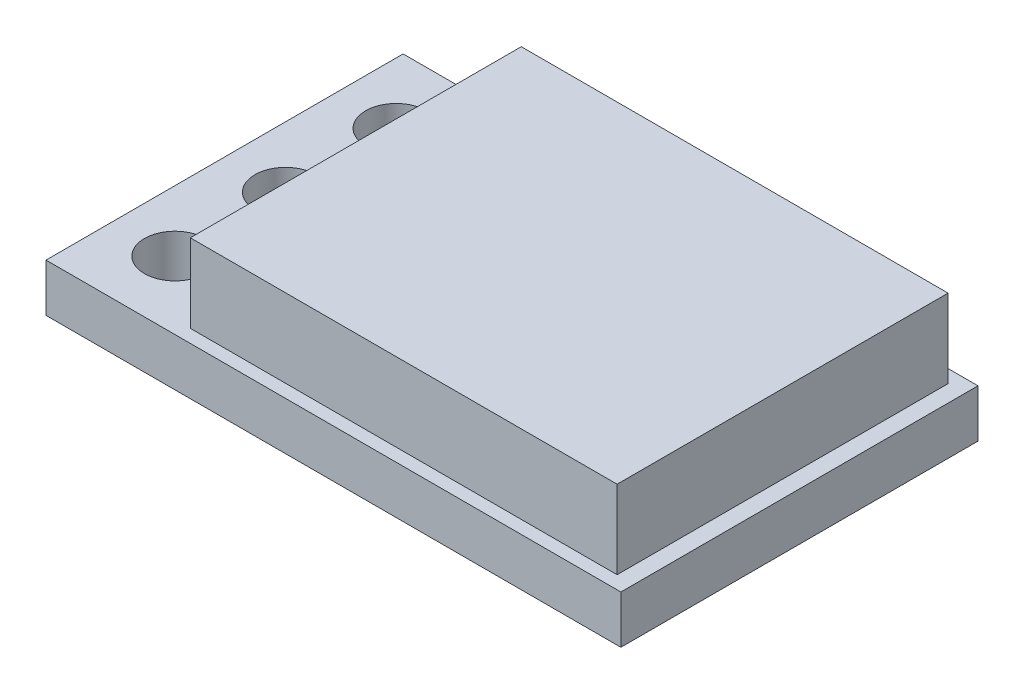
ISO-10303-21;
HEADER;
FILE_DESCRIPTION(('STEP AP214'),'2;1');
FILE_NAME('part.step','',(''),(''),'','','');
FILE_SCHEMA(('AUTOMOTIVE_DESIGN { 1 0 10303 214 1 1 1 1 }'));
ENDSEC;
DATA;
#1=APPLICATION_CONTEXT('core data for automotive mechanical design processes');
#2=APPLICATION_PROTOCOL_DEFINITION('international standard','automotive_design',2000,#1);
#3=PRODUCT_CONTEXT('',#1,'mechanical');
#4=PRODUCT('Part','Part','',(#3));
#5=PRODUCT_RELATED_PRODUCT_CATEGORY('part','',(#4));
#6=PRODUCT_DEFINITION_FORMATION('','',#4);
#7=PRODUCT_DEFINITION_CONTEXT('part definition',#1,'design');
#8=PRODUCT_DEFINITION('design','',#6,#7);
#9=PRODUCT_DEFINITION_SHAPE('','',#8);
#10=(LENGTH_UNIT() NAMED_UNIT(*) SI_UNIT(.MILLI.,.METRE.));
#11=(NAMED_UNIT(*) PLANE_ANGLE_UNIT() SI_UNIT($,.RADIAN.));
#12=(NAMED_UNIT(*) SI_UNIT($,.STERADIAN.) SOLID_ANGLE_UNIT());
#13=UNCERTAINTY_MEASURE_WITH_UNIT(LENGTH_MEASURE(1.E-05),#10,'distance_accuracy_value','');
#14=(GEOMETRIC_REPRESENTATION_CONTEXT(3) GLOBAL_UNCERTAINTY_ASSIGNED_CONTEXT((#13)) GLOBAL_UNIT_ASSIGNED_CONTEXT((#10,
#11,#12)) REPRESENTATION_CONTEXT('',''));
#15=CARTESIAN_POINT('',(0.,0.,0.));
#16=DIRECTION('',(0.,0.,1.));
#17=DIRECTION('',(1.,0.,0.));
#18=AXIS2_PLACEMENT_3D('',#15,#16,#17);
#19=CARTESIAN_POINT('',(6.6,1.1,-4.1));
#20=DIRECTION('',(-1.,0.,0.));
#21=DIRECTION('',(0.,0.,1.));
#22=AXIS2_PLACEMENT_3D('',#19,#20,#21);
#23=PLANE('',#22);
#24=DIRECTION('',(0.,0.,-1.));
#25=VECTOR('',#24,1.);
#26=CARTESIAN_POINT('',(6.6,0.,-4.1));
#27=LINE('',#26,#25);
#28=CARTESIAN_POINT('',(6.6,0.,4.1));
#29=VERTEX_POINT('',#28);
#30=CARTESIAN_POINT('',(6.6,0.,-4.1));
#31=VERTEX_POINT('',#30);
#32=EDGE_CURVE('E118',#29,#31,#27,.T.);
#33=ORIENTED_EDGE('',*,*,#32,.T.);
#34=DIRECTION('',(0.,-1.,0.));
#35=VECTOR('',#34,1.);
#36=CARTESIAN_POINT('',(6.6,1.1,-4.1));
#37=LINE('',#36,#35);
#38=CARTESIAN_POINT('',(6.6,1.1,-4.1));
#39=VERTEX_POINT('',#38);
#40=EDGE_CURVE('E11',#39,#31,#37,.T.);
#41=ORIENTED_EDGE('',*,*,#40,.F.);
#42=DIRECTION('',(0.,0.,-1.));
#43=VECTOR('',#42,1.);
#44=CARTESIAN_POINT('',(6.6,1.1,-4.1));
#45=LINE('',#44,#43);
#46=CARTESIAN_POINT('',(6.6,1.1,4.1));
#47=VERTEX_POINT('',#46);
#48=EDGE_CURVE('E127',#47,#39,#45,.T.);
#49=ORIENTED_EDGE('',*,*,#48,.F.);
#50=DIRECTION('',(0.,-1.,0.));
#51=VECTOR('',#50,1.);
#52=CARTESIAN_POINT('',(6.6,1.1,4.1));
#53=LINE('',#52,#51);
#54=EDGE_CURVE('E136',#47,#29,#53,.T.);
#55=ORIENTED_EDGE('',*,*,#54,.T.);
#56=EDGE_LOOP('',(#33,#41,#49,#55));
#57=FACE_BOUND('',#56,.T.);
#58=ADVANCED_FACE('F34',(#57),#23,.F.);
#59=CARTESIAN_POINT('',(-6.6,1.1,-4.1));
#60=DIRECTION('',(0.,0.,1.));
#61=DIRECTION('',(1.,0.,0.));
#62=AXIS2_PLACEMENT_3D('',#59,#60,#61);
#63=PLANE('',#62);
#64=DIRECTION('',(-1.,0.,0.));
#65=VECTOR('',#64,1.);
#66=CARTESIAN_POINT('',(-6.6,0.,-4.1));
#67=LINE('',#66,#65);
#68=CARTESIAN_POINT('',(-6.6,0.,-4.1));
#69=VERTEX_POINT('',#68);
#70=EDGE_CURVE('E121',#31,#69,#67,.T.);
#71=ORIENTED_EDGE('',*,*,#70,.T.);
#72=DIRECTION('',(0.,-1.,0.));
#73=VECTOR('',#72,1.);
#74=CARTESIAN_POINT('',(-6.6,1.1,-4.1));
#75=LINE('',#74,#73);
#76=CARTESIAN_POINT('',(-6.6,1.1,-4.1));
#77=VERTEX_POINT('',#76);
#78=EDGE_CURVE('E41',#77,#69,#75,.T.);
#79=ORIENTED_EDGE('',*,*,#78,.F.);
#80=DIRECTION('',(-1.,0.,0.));
#81=VECTOR('',#80,1.);
#82=CARTESIAN_POINT('',(-6.6,1.1,-4.1));
#83=LINE('',#82,#81);
#84=EDGE_CURVE('E130',#39,#77,#83,.T.);
#85=ORIENTED_EDGE('',*,*,#84,.F.);
#86=ORIENTED_EDGE('',*,*,#40,.T.);
#87=EDGE_LOOP('',(#71,#79,#85,#86));
#88=FACE_BOUND('',#87,.T.);
#89=ADVANCED_FACE('F167',(#88),#63,.F.);
#90=CARTESIAN_POINT('',(-6.6,1.1,-4.1));
#91=DIRECTION('',(1.,0.,0.));
#92=DIRECTION('',(0.,0.,-1.));
#93=AXIS2_PLACEMENT_3D('',#90,#91,#92);
#94=PLANE('',#93);
#95=DIRECTION('',(0.,0.,1.));
#96=VECTOR('',#95,1.);
#97=CARTESIAN_POINT('',(-6.6,0.,-4.1));
#98=LINE('',#97,#96);
#99=CARTESIAN_POINT('',(-6.6,0.,4.1));
#100=VERTEX_POINT('',#99);
#101=EDGE_CURVE('E139',#69,#100,#98,.T.);
#102=ORIENTED_EDGE('',*,*,#101,.T.);
#103=DIRECTION('',(0.,-1.,0.));
#104=VECTOR('',#103,1.);
#105=CARTESIAN_POINT('',(-6.6,1.1,4.1));
#106=LINE('',#105,#104);
#107=CARTESIAN_POINT('',(-6.6,1.1,4.1));
#108=VERTEX_POINT('',#107);
#109=EDGE_CURVE('E144',#108,#100,#106,.T.);
#110=ORIENTED_EDGE('',*,*,#109,.F.);
#111=DIRECTION('',(0.,0.,1.));
#112=VECTOR('',#111,1.);
#113=CARTESIAN_POINT('',(-6.6,1.1,-4.1));
#114=LINE('',#113,#112);
#115=EDGE_CURVE('E133',#77,#108,#114,.T.);
#116=ORIENTED_EDGE('',*,*,#115,.F.);
#117=ORIENTED_EDGE('',*,*,#78,.T.);
#118=EDGE_LOOP('',(#102,#110,#116,#117));
#119=FACE_BOUND('',#118,.T.);
#120=ADVANCED_FACE('F151',(#119),#94,.F.);
#121=CARTESIAN_POINT('',(-6.6,1.1,4.1));
#122=DIRECTION('',(0.,0.,-1.));
#123=DIRECTION('',(-1.,0.,0.));
#124=AXIS2_PLACEMENT_3D('',#121,#122,#123);
#125=PLANE('',#124);
#126=DIRECTION('',(1.,0.,0.));
#127=VECTOR('',#126,1.);
#128=CARTESIAN_POINT('',(-6.6,0.,4.1));
#129=LINE('',#128,#127);
#130=EDGE_CURVE('E131',#100,#29,#129,.T.);
#131=ORIENTED_EDGE('',*,*,#130,.T.);
#132=ORIENTED_EDGE('',*,*,#54,.F.);
#133=DIRECTION('',(1.,0.,0.));
#134=VECTOR('',#133,1.);
#135=CARTESIAN_POINT('',(-6.6,1.1,4.1));
#136=LINE('',#135,#134);
#137=EDGE_CURVE('E135',#108,#47,#136,.T.);
#138=ORIENTED_EDGE('',*,*,#137,.F.);
#139=ORIENTED_EDGE('',*,*,#109,.T.);
#140=EDGE_LOOP('',(#131,#132,#138,#139));
#141=FACE_BOUND('',#140,.T.);
#142=ADVANCED_FACE('F160',(#141),#125,.F.);
#143=CARTESIAN_POINT('',(0.,1.1,0.));
#144=DIRECTION('',(0.,1.,0.));
#145=DIRECTION('',(0.,0.,1.));
#146=AXIS2_PLACEMENT_3D('',#143,#144,#145);
#147=PLANE('',#146);
#148=CARTESIAN_POINT('',(-5.19999999999999,1.1,2.54));
#149=DIRECTION('',(0.,1.,0.));
#150=DIRECTION('',(0.,0.,1.));
#151=AXIS2_PLACEMENT_3D('',#148,#149,#150);
#152=CIRCLE('',#151,0.700000000000002);
#153=CARTESIAN_POINT('',(-5.19999999999999,1.1,3.24));
#154=VERTEX_POINT('',#153);
#155=EDGE_CURVE('E216',#154,#154,#152,.T.);
#156=ORIENTED_EDGE('',*,*,#155,.F.);
#157=EDGE_LOOP('',(#156));
#158=FACE_BOUND('',#157,.T.);
#159=CARTESIAN_POINT('',(-5.2,1.1,0.));
#160=DIRECTION('',(0.,1.,0.));
#161=DIRECTION('',(0.,0.,1.));
#162=AXIS2_PLACEMENT_3D('',#159,#160,#161);
#163=CIRCLE('',#162,0.700000000000002);
#164=CARTESIAN_POINT('',(-5.2,1.1,0.700000000000002));
#165=VERTEX_POINT('',#164);
#166=EDGE_CURVE('E221',#165,#165,#163,.T.);
#167=ORIENTED_EDGE('',*,*,#166,.F.);
#168=EDGE_LOOP('',(#167));
#169=FACE_BOUND('',#168,.T.);
#170=CARTESIAN_POINT('',(-5.20000000000001,1.1,-2.54));
#171=DIRECTION('',(0.,1.,0.));
#172=DIRECTION('',(0.,0.,1.));
#173=AXIS2_PLACEMENT_3D('',#170,#171,#172);
#174=CIRCLE('',#173,0.700000000000002);
#175=CARTESIAN_POINT('',(-5.20000000000001,1.1,-1.84));
#176=VERTEX_POINT('',#175);
#177=EDGE_CURVE('E229',#176,#176,#174,.T.);
#178=ORIENTED_EDGE('',*,*,#177,.F.);
#179=EDGE_LOOP('',(#178));
#180=FACE_BOUND('',#179,.T.);
#181=DIRECTION('',(0.,0.,-1.));
#182=VECTOR('',#181,1.);
#183=CARTESIAN_POINT('',(6.21315789473685,1.1,-3.8));
#184=LINE('',#183,#182);
#185=CARTESIAN_POINT('',(6.21315789473685,1.1,3.8));
#186=VERTEX_POINT('',#185);
#187=CARTESIAN_POINT('',(6.21315789473685,1.1,-3.8));
#188=VERTEX_POINT('',#187);
#189=EDGE_CURVE('E48',#186,#188,#184,.T.);
#190=ORIENTED_EDGE('',*,*,#189,.F.);
#191=DIRECTION('',(1.,0.,0.));
#192=VECTOR('',#191,1.);
#193=CARTESIAN_POINT('',(-3.58684210526315,1.1,3.8));
#194=LINE('',#193,#192);
#195=CARTESIAN_POINT('',(-3.58684210526315,1.1,3.8));
#196=VERTEX_POINT('',#195);
#197=EDGE_CURVE('E52',#196,#186,#194,.T.);
#198=ORIENTED_EDGE('',*,*,#197,.F.);
#199=DIRECTION('',(0.,0.,1.));
#200=VECTOR('',#199,1.);
#201=CARTESIAN_POINT('',(-3.58684210526316,1.1,-3.8));
#202=LINE('',#201,#200);
#203=CARTESIAN_POINT('',(-3.58684210526316,1.1,-3.8));
#204=VERTEX_POINT('',#203);
#205=EDGE_CURVE('E238',#204,#196,#202,.T.);
#206=ORIENTED_EDGE('',*,*,#205,.F.);
#207=DIRECTION('',(-1.,0.,0.));
#208=VECTOR('',#207,1.);
#209=CARTESIAN_POINT('',(-3.58684210526316,1.1,-3.8));
#210=LINE('',#209,#208);
#211=EDGE_CURVE('E236',#188,#204,#210,.T.);
#212=ORIENTED_EDGE('',*,*,#211,.F.);
#213=EDGE_LOOP('',(#190,#198,#206,#212));
#214=FACE_BOUND('',#213,.T.);
#215=ORIENTED_EDGE('',*,*,#48,.T.);
#216=ORIENTED_EDGE('',*,*,#84,.T.);
#217=ORIENTED_EDGE('',*,*,#115,.T.);
#218=ORIENTED_EDGE('',*,*,#137,.T.);
#219=EDGE_LOOP('',(#215,#216,#217,#218));
#220=FACE_BOUND('',#219,.T.);
#221=ADVANCED_FACE('F166',(#158,#169,#180,#214,#220),#147,.T.);
#222=CARTESIAN_POINT('',(0.,0.,0.));
#223=DIRECTION('',(0.,1.,0.));
#224=DIRECTION('',(0.,0.,1.));
#225=AXIS2_PLACEMENT_3D('',#222,#223,#224);
#226=PLANE('',#225);
#227=CARTESIAN_POINT('',(-5.19999999999999,0.,2.54));
#228=DIRECTION('',(0.,1.,0.));
#229=DIRECTION('',(0.,0.,1.));
#230=AXIS2_PLACEMENT_3D('',#227,#228,#229);
#231=CIRCLE('',#230,0.700000000000002);
#232=CARTESIAN_POINT('',(-5.19999999999999,0.,3.24));
#233=VERTEX_POINT('',#232);
#234=EDGE_CURVE('E213',#233,#233,#231,.T.);
#235=ORIENTED_EDGE('',*,*,#234,.T.);
#236=EDGE_LOOP('',(#235));
#237=FACE_BOUND('',#236,.T.);
#238=CARTESIAN_POINT('',(-5.2,0.,0.));
#239=DIRECTION('',(0.,1.,0.));
#240=DIRECTION('',(0.,0.,1.));
#241=AXIS2_PLACEMENT_3D('',#238,#239,#240);
#242=CIRCLE('',#241,0.700000000000002);
#243=CARTESIAN_POINT('',(-5.2,0.,0.700000000000002));
#244=VERTEX_POINT('',#243);
#245=EDGE_CURVE('E217',#244,#244,#242,.T.);
#246=ORIENTED_EDGE('',*,*,#245,.T.);
#247=EDGE_LOOP('',(#246));
#248=FACE_BOUND('',#247,.T.);
#249=CARTESIAN_POINT('',(-5.20000000000001,0.,-2.54));
#250=DIRECTION('',(0.,1.,0.));
#251=DIRECTION('',(0.,0.,1.));
#252=AXIS2_PLACEMENT_3D('',#249,#250,#251);
#253=CIRCLE('',#252,0.700000000000002);
#254=CARTESIAN_POINT('',(-5.20000000000001,0.,-1.84));
#255=VERTEX_POINT('',#254);
#256=EDGE_CURVE('E226',#255,#255,#253,.T.);
#257=ORIENTED_EDGE('',*,*,#256,.T.);
#258=EDGE_LOOP('',(#257));
#259=FACE_BOUND('',#258,.T.);
#260=ORIENTED_EDGE('',*,*,#32,.F.);
#261=ORIENTED_EDGE('',*,*,#130,.F.);
#262=ORIENTED_EDGE('',*,*,#101,.F.);
#263=ORIENTED_EDGE('',*,*,#70,.F.);
#264=EDGE_LOOP('',(#260,#261,#262,#263));
#265=FACE_BOUND('',#264,.T.);
#266=ADVANCED_FACE('F157',(#237,#248,#259,#265),#226,.F.);
#267=CARTESIAN_POINT('',(6.21315789473685,2.9,-3.8));
#268=DIRECTION('',(-1.,0.,0.));
#269=DIRECTION('',(0.,0.,1.));
#270=AXIS2_PLACEMENT_3D('',#267,#268,#269);
#271=PLANE('',#270);
#272=ORIENTED_EDGE('',*,*,#189,.T.);
#273=DIRECTION('',(0.,-1.,0.));
#274=VECTOR('',#273,1.);
#275=CARTESIAN_POINT('',(6.21315789473685,2.9,-3.8));
#276=LINE('',#275,#274);
#277=CARTESIAN_POINT('',(6.21315789473685,2.9,-3.8));
#278=VERTEX_POINT('',#277);
#279=EDGE_CURVE('E101',#278,#188,#276,.T.);
#280=ORIENTED_EDGE('',*,*,#279,.F.);
#281=DIRECTION('',(0.,0.,-1.));
#282=VECTOR('',#281,1.);
#283=CARTESIAN_POINT('',(6.21315789473685,2.9,-3.8));
#284=LINE('',#283,#282);
#285=CARTESIAN_POINT('',(6.21315789473685,2.9,3.8));
#286=VERTEX_POINT('',#285);
#287=EDGE_CURVE('E107',#286,#278,#284,.T.);
#288=ORIENTED_EDGE('',*,*,#287,.F.);
#289=DIRECTION('',(0.,-1.,0.));
#290=VECTOR('',#289,1.);
#291=CARTESIAN_POINT('',(6.21315789473685,2.9,3.8));
#292=LINE('',#291,#290);
#293=EDGE_CURVE('E234',#286,#186,#292,.T.);
#294=ORIENTED_EDGE('',*,*,#293,.T.);
#295=EDGE_LOOP('',(#272,#280,#288,#294));
#296=FACE_BOUND('',#295,.T.);
#297=ADVANCED_FACE('F117',(#296),#271,.F.);
#298=CARTESIAN_POINT('',(-3.58684210526316,2.9,-3.8));
#299=DIRECTION('',(0.,0.,1.));
#300=DIRECTION('',(1.,0.,0.));
#301=AXIS2_PLACEMENT_3D('',#298,#299,#300);
#302=PLANE('',#301);
#303=ORIENTED_EDGE('',*,*,#211,.T.);
#304=DIRECTION('',(0.,-1.,0.));
#305=VECTOR('',#304,1.);
#306=CARTESIAN_POINT('',(-3.58684210526316,2.9,-3.8));
#307=LINE('',#306,#305);
#308=CARTESIAN_POINT('',(-3.58684210526316,2.9,-3.8));
#309=VERTEX_POINT('',#308);
#310=EDGE_CURVE('E103',#309,#204,#307,.T.);
#311=ORIENTED_EDGE('',*,*,#310,.F.);
#312=DIRECTION('',(-1.,0.,0.));
#313=VECTOR('',#312,1.);
#314=CARTESIAN_POINT('',(-3.58684210526316,2.9,-3.8));
#315=LINE('',#314,#313);
#316=EDGE_CURVE('E96',#278,#309,#315,.T.);
#317=ORIENTED_EDGE('',*,*,#316,.F.);
#318=ORIENTED_EDGE('',*,*,#279,.T.);
#319=EDGE_LOOP('',(#303,#311,#317,#318));
#320=FACE_BOUND('',#319,.T.);
#321=ADVANCED_FACE('F99',(#320),#302,.F.);
#322=CARTESIAN_POINT('',(-3.58684210526316,2.9,-3.8));
#323=DIRECTION('',(1.,0.,0.));
#324=DIRECTION('',(0.,0.,-1.));
#325=AXIS2_PLACEMENT_3D('',#322,#323,#324);
#326=PLANE('',#325);
#327=ORIENTED_EDGE('',*,*,#205,.T.);
#328=DIRECTION('',(0.,-1.,0.));
#329=VECTOR('',#328,1.);
#330=CARTESIAN_POINT('',(-3.58684210526315,2.9,3.8));
#331=LINE('',#330,#329);
#332=CARTESIAN_POINT('',(-3.58684210526315,2.9,3.8));
#333=VERTEX_POINT('',#332);
#334=EDGE_CURVE('E123',#333,#196,#331,.T.);
#335=ORIENTED_EDGE('',*,*,#334,.F.);
#336=DIRECTION('',(0.,0.,1.));
#337=VECTOR('',#336,1.);
#338=CARTESIAN_POINT('',(-3.58684210526316,2.9,-3.8));
#339=LINE('',#338,#337);
#340=EDGE_CURVE('E106',#309,#333,#339,.T.);
#341=ORIENTED_EDGE('',*,*,#340,.F.);
#342=ORIENTED_EDGE('',*,*,#310,.T.);
#343=EDGE_LOOP('',(#327,#335,#341,#342));
#344=FACE_BOUND('',#343,.T.);
#345=ADVANCED_FACE('F187',(#344),#326,.F.);
#346=CARTESIAN_POINT('',(-3.58684210526315,2.9,3.8));
#347=DIRECTION('',(0.,0.,-1.));
#348=DIRECTION('',(-1.,0.,0.));
#349=AXIS2_PLACEMENT_3D('',#346,#347,#348);
#350=PLANE('',#349);
#351=ORIENTED_EDGE('',*,*,#197,.T.);
#352=ORIENTED_EDGE('',*,*,#293,.F.);
#353=DIRECTION('',(1.,0.,0.));
#354=VECTOR('',#353,1.);
#355=CARTESIAN_POINT('',(-3.58684210526315,2.9,3.8));
#356=LINE('',#355,#354);
#357=EDGE_CURVE('E112',#333,#286,#356,.T.);
#358=ORIENTED_EDGE('',*,*,#357,.F.);
#359=ORIENTED_EDGE('',*,*,#334,.T.);
#360=EDGE_LOOP('',(#351,#352,#358,#359));
#361=FACE_BOUND('',#360,.T.);
#362=ADVANCED_FACE('F190',(#361),#350,.F.);
#363=CARTESIAN_POINT('',(0.,2.9,0.));
#364=DIRECTION('',(0.,1.,0.));
#365=DIRECTION('',(0.,0.,1.));
#366=AXIS2_PLACEMENT_3D('',#363,#364,#365);
#367=PLANE('',#366);
#368=ORIENTED_EDGE('',*,*,#287,.T.);
#369=ORIENTED_EDGE('',*,*,#316,.T.);
#370=ORIENTED_EDGE('',*,*,#340,.T.);
#371=ORIENTED_EDGE('',*,*,#357,.T.);
#372=EDGE_LOOP('',(#368,#369,#370,#371));
#373=FACE_BOUND('',#372,.T.);
#374=ADVANCED_FACE('F110',(#373),#367,.T.);
#375=CARTESIAN_POINT('',(-5.20000000000001,0.,-2.54));
#376=DIRECTION('',(0.,1.,0.));
#377=DIRECTION('',(0.,0.,1.));
#378=AXIS2_PLACEMENT_3D('',#375,#376,#377);
#379=CYLINDRICAL_SURFACE('',#378,0.700000000000002);
#380=ORIENTED_EDGE('',*,*,#256,.F.);
#381=EDGE_LOOP('',(#380));
#382=FACE_BOUND('',#381,.T.);
#383=ORIENTED_EDGE('',*,*,#177,.T.);
#384=EDGE_LOOP('',(#383));
#385=FACE_BOUND('',#384,.T.);
#386=ADVANCED_FACE('F197',(#382,#385),#379,.F.);
#387=CARTESIAN_POINT('',(-5.2,0.,0.));
#388=DIRECTION('',(0.,1.,0.));
#389=DIRECTION('',(0.,0.,1.));
#390=AXIS2_PLACEMENT_3D('',#387,#388,#389);
#391=CYLINDRICAL_SURFACE('',#390,0.700000000000002);
#392=ORIENTED_EDGE('',*,*,#245,.F.);
#393=EDGE_LOOP('',(#392));
#394=FACE_BOUND('',#393,.T.);
#395=ORIENTED_EDGE('',*,*,#166,.T.);
#396=EDGE_LOOP('',(#395));
#397=FACE_BOUND('',#396,.T.);
#398=ADVANCED_FACE('F200',(#394,#397),#391,.F.);
#399=CARTESIAN_POINT('',(-5.19999999999999,0.,2.54));
#400=DIRECTION('',(0.,1.,0.));
#401=DIRECTION('',(0.,0.,1.));
#402=AXIS2_PLACEMENT_3D('',#399,#400,#401);
#403=CYLINDRICAL_SURFACE('',#402,0.700000000000002);
#404=ORIENTED_EDGE('',*,*,#234,.F.);
#405=EDGE_LOOP('',(#404));
#406=FACE_BOUND('',#405,.T.);
#407=ORIENTED_EDGE('',*,*,#155,.T.);
#408=EDGE_LOOP('',(#407));
#409=FACE_BOUND('',#408,.T.);
#410=ADVANCED_FACE('F204',(#406,#409),#403,.F.);
#411=CLOSED_SHELL('',(#58,#89,#120,#142,#221,#266,#297,#321,#345,#362,#374,#386,#398,#410));
#412=MANIFOLD_SOLID_BREP('B2',#411);
#413=ADVANCED_BREP_SHAPE_REPRESENTATION('',(#18,#412),#14);
#414=SHAPE_DEFINITION_REPRESENTATION(#9,#413);
ENDSEC;
END-ISO-10303-21;
